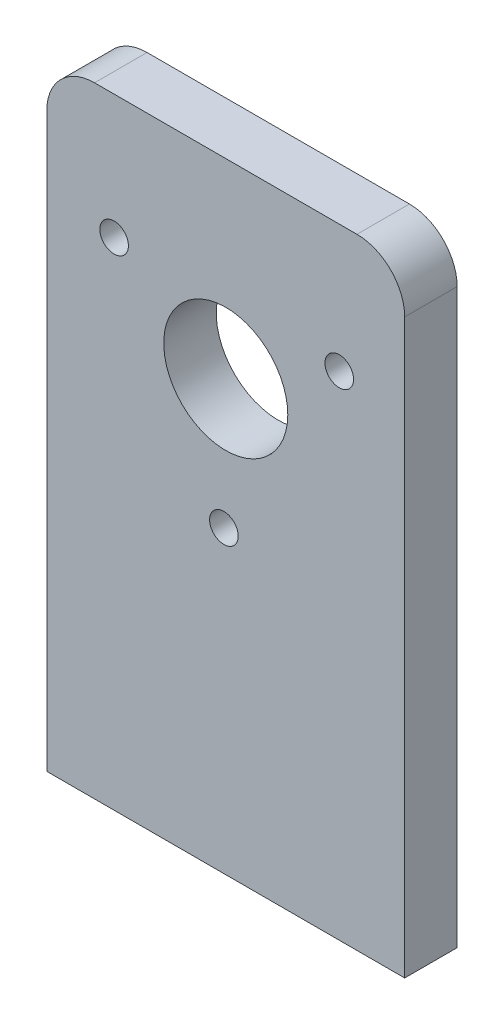
ISO-10303-21;
HEADER;
FILE_DESCRIPTION(('STEP AP214'),'2;1');
FILE_NAME('part.step','',(''),(''),'','','');
FILE_SCHEMA(('AUTOMOTIVE_DESIGN { 1 0 10303 214 1 1 1 1 }'));
ENDSEC;
DATA;
#1=APPLICATION_CONTEXT('core data for automotive mechanical design processes');
#2=APPLICATION_PROTOCOL_DEFINITION('international standard','automotive_design',2000,#1);
#3=PRODUCT_CONTEXT('',#1,'mechanical');
#4=PRODUCT('Part','Part','',(#3));
#5=PRODUCT_RELATED_PRODUCT_CATEGORY('part','',(#4));
#6=PRODUCT_DEFINITION_FORMATION('','',#4);
#7=PRODUCT_DEFINITION_CONTEXT('part definition',#1,'design');
#8=PRODUCT_DEFINITION('design','',#6,#7);
#9=PRODUCT_DEFINITION_SHAPE('','',#8);
#10=(LENGTH_UNIT() NAMED_UNIT(*) SI_UNIT(.MILLI.,.METRE.));
#11=(NAMED_UNIT(*) PLANE_ANGLE_UNIT() SI_UNIT($,.RADIAN.));
#12=(NAMED_UNIT(*) SI_UNIT($,.STERADIAN.) SOLID_ANGLE_UNIT());
#13=UNCERTAINTY_MEASURE_WITH_UNIT(LENGTH_MEASURE(1.E-05),#10,'distance_accuracy_value','');
#14=(GEOMETRIC_REPRESENTATION_CONTEXT(3) GLOBAL_UNCERTAINTY_ASSIGNED_CONTEXT((#13)) GLOBAL_UNIT_ASSIGNED_CONTEXT((#10,
#11,#12)) REPRESENTATION_CONTEXT('',''));
#15=CARTESIAN_POINT('',(0.,0.,0.));
#16=DIRECTION('',(0.,0.,1.));
#17=DIRECTION('',(1.,0.,0.));
#18=AXIS2_PLACEMENT_3D('',#15,#16,#17);
#19=CARTESIAN_POINT('',(10.,120.,11.));
#20=DIRECTION('',(0.,0.,-1.));
#21=DIRECTION('',(-1.,0.,0.));
#22=AXIS2_PLACEMENT_3D('',#19,#20,#21);
#23=PLANE('',#22);
#24=DIRECTION('',(0.,-1.,0.));
#25=VECTOR('',#24,1.);
#26=CARTESIAN_POINT('',(0.,0.,11.));
#27=LINE('',#26,#25);
#28=CARTESIAN_POINT('',(0.,120.,11.));
#29=VERTEX_POINT('',#28);
#30=CARTESIAN_POINT('',(0.,0.,11.));
#31=VERTEX_POINT('',#30);
#32=EDGE_CURVE('E135',#29,#31,#27,.T.);
#33=ORIENTED_EDGE('',*,*,#32,.T.);
#34=DIRECTION('',(1.,0.,0.));
#35=VECTOR('',#34,1.);
#36=CARTESIAN_POINT('',(0.,0.,11.));
#37=LINE('',#36,#35);
#38=CARTESIAN_POINT('',(75.,0.,11.));
#39=VERTEX_POINT('',#38);
#40=EDGE_CURVE('E93',#31,#39,#37,.T.);
#41=ORIENTED_EDGE('',*,*,#40,.T.);
#42=DIRECTION('',(0.,1.,0.));
#43=VECTOR('',#42,1.);
#44=CARTESIAN_POINT('',(75.,0.,11.));
#45=LINE('',#44,#43);
#46=CARTESIAN_POINT('',(75.,120.,11.));
#47=VERTEX_POINT('',#46);
#48=EDGE_CURVE('E106',#39,#47,#45,.T.);
#49=ORIENTED_EDGE('',*,*,#48,.T.);
#50=CARTESIAN_POINT('',(65.,120.,11.));
#51=DIRECTION('',(0.,0.,1.));
#52=DIRECTION('',(1.,0.,0.));
#53=AXIS2_PLACEMENT_3D('',#50,#51,#52);
#54=CIRCLE('',#53,9.99999999999999);
#55=CARTESIAN_POINT('',(64.9999999999999,130.,11.));
#56=VERTEX_POINT('',#55);
#57=EDGE_CURVE('E100',#47,#56,#54,.T.);
#58=ORIENTED_EDGE('',*,*,#57,.T.);
#59=DIRECTION('',(-1.,0.,0.));
#60=VECTOR('',#59,1.);
#61=CARTESIAN_POINT('',(10.0000000000001,130.,11.));
#62=LINE('',#61,#60);
#63=CARTESIAN_POINT('',(10.0000000000001,130.,11.));
#64=VERTEX_POINT('',#63);
#65=EDGE_CURVE('E104',#56,#64,#62,.T.);
#66=ORIENTED_EDGE('',*,*,#65,.T.);
#67=CARTESIAN_POINT('',(10.,120.,11.));
#68=DIRECTION('',(0.,0.,1.));
#69=DIRECTION('',(-1.,0.,0.));
#70=AXIS2_PLACEMENT_3D('',#67,#68,#69);
#71=CIRCLE('',#70,10.);
#72=EDGE_CURVE('E56',#64,#29,#71,.T.);
#73=ORIENTED_EDGE('',*,*,#72,.T.);
#74=EDGE_LOOP('',(#33,#41,#49,#58,#66,#73));
#75=FACE_BOUND('',#74,.T.);
#76=CARTESIAN_POINT('',(37.5,90.,11.));
#77=DIRECTION('',(0.,0.,1.));
#78=DIRECTION('',(1.,0.,0.));
#79=AXIS2_PLACEMENT_3D('',#76,#77,#78);
#80=CIRCLE('',#79,13.);
#81=CARTESIAN_POINT('',(50.5,90.,11.));
#82=VERTEX_POINT('',#81);
#83=EDGE_CURVE('E128',#82,#82,#80,.T.);
#84=ORIENTED_EDGE('',*,*,#83,.F.);
#85=EDGE_LOOP('',(#84));
#86=FACE_BOUND('',#85,.T.);
#87=CARTESIAN_POINT('',(61.2914469463669,103.286442420686,11.));
#88=DIRECTION('',(0.,0.,1.));
#89=DIRECTION('',(1.,0.,0.));
#90=AXIS2_PLACEMENT_3D('',#87,#88,#89);
#91=CIRCLE('',#90,3.);
#92=CARTESIAN_POINT('',(64.2914469463669,103.286442420686,11.));
#93=VERTEX_POINT('',#92);
#94=EDGE_CURVE('E199',#93,#93,#91,.T.);
#95=ORIENTED_EDGE('',*,*,#94,.F.);
#96=EDGE_LOOP('',(#95));
#97=FACE_BOUND('',#96,.T.);
#98=CARTESIAN_POINT('',(14.097879864583,103.960776238,11.));
#99=DIRECTION('',(0.,0.,1.));
#100=DIRECTION('',(1.,0.,0.));
#101=AXIS2_PLACEMENT_3D('',#98,#99,#100);
#102=CIRCLE('',#101,3.);
#103=CARTESIAN_POINT('',(17.097879864583,103.960776238,11.));
#104=VERTEX_POINT('',#103);
#105=EDGE_CURVE('E193',#104,#104,#102,.T.);
#106=ORIENTED_EDGE('',*,*,#105,.F.);
#107=EDGE_LOOP('',(#106));
#108=FACE_BOUND('',#107,.T.);
#109=CARTESIAN_POINT('',(37.11067318905,62.7527813413135,11.));
#110=DIRECTION('',(0.,0.,1.));
#111=DIRECTION('',(1.,0.,0.));
#112=AXIS2_PLACEMENT_3D('',#109,#110,#111);
#113=CIRCLE('',#112,3.);
#114=CARTESIAN_POINT('',(40.11067318905,62.7527813413135,11.));
#115=VERTEX_POINT('',#114);
#116=EDGE_CURVE('E184',#115,#115,#113,.T.);
#117=ORIENTED_EDGE('',*,*,#116,.F.);
#118=EDGE_LOOP('',(#117));
#119=FACE_BOUND('',#118,.T.);
#120=ADVANCED_FACE('F39',(#75,#86,#97,#108,#119),#23,.F.);
#121=CARTESIAN_POINT('',(10.,120.,0.));
#122=DIRECTION('',(0.,0.,-1.));
#123=DIRECTION('',(-1.,0.,0.));
#124=AXIS2_PLACEMENT_3D('',#121,#122,#123);
#125=PLANE('',#124);
#126=CARTESIAN_POINT('',(14.097879864583,103.960776238,0.));
#127=DIRECTION('',(0.,0.,1.));
#128=DIRECTION('',(1.,0.,0.));
#129=AXIS2_PLACEMENT_3D('',#126,#127,#128);
#130=CIRCLE('',#129,3.);
#131=CARTESIAN_POINT('',(17.097879864583,103.960776238,0.));
#132=VERTEX_POINT('',#131);
#133=EDGE_CURVE('E190',#132,#132,#130,.T.);
#134=ORIENTED_EDGE('',*,*,#133,.T.);
#135=EDGE_LOOP('',(#134));
#136=FACE_BOUND('',#135,.T.);
#137=CARTESIAN_POINT('',(37.5,90.,0.));
#138=DIRECTION('',(0.,0.,1.));
#139=DIRECTION('',(1.,0.,0.));
#140=AXIS2_PLACEMENT_3D('',#137,#138,#139);
#141=CIRCLE('',#140,13.);
#142=CARTESIAN_POINT('',(50.5,90.,0.));
#143=VERTEX_POINT('',#142);
#144=EDGE_CURVE('E202',#143,#143,#141,.T.);
#145=ORIENTED_EDGE('',*,*,#144,.T.);
#146=EDGE_LOOP('',(#145));
#147=FACE_BOUND('',#146,.T.);
#148=DIRECTION('',(0.,-1.,0.));
#149=VECTOR('',#148,1.);
#150=CARTESIAN_POINT('',(0.,0.,0.));
#151=LINE('',#150,#149);
#152=CARTESIAN_POINT('',(0.,120.,0.));
#153=VERTEX_POINT('',#152);
#154=CARTESIAN_POINT('',(0.,0.,0.));
#155=VERTEX_POINT('',#154);
#156=EDGE_CURVE('E124',#153,#155,#151,.T.);
#157=ORIENTED_EDGE('',*,*,#156,.F.);
#158=CARTESIAN_POINT('',(10.,120.,0.));
#159=DIRECTION('',(0.,0.,1.));
#160=DIRECTION('',(-1.,0.,0.));
#161=AXIS2_PLACEMENT_3D('',#158,#159,#160);
#162=CIRCLE('',#161,10.);
#163=CARTESIAN_POINT('',(10.0000000000001,130.,0.));
#164=VERTEX_POINT('',#163);
#165=EDGE_CURVE('E85',#164,#153,#162,.T.);
#166=ORIENTED_EDGE('',*,*,#165,.F.);
#167=DIRECTION('',(-1.,0.,0.));
#168=VECTOR('',#167,1.);
#169=CARTESIAN_POINT('',(10.0000000000001,130.,0.));
#170=LINE('',#169,#168);
#171=CARTESIAN_POINT('',(64.9999999999999,130.,0.));
#172=VERTEX_POINT('',#171);
#173=EDGE_CURVE('E79',#172,#164,#170,.T.);
#174=ORIENTED_EDGE('',*,*,#173,.F.);
#175=CARTESIAN_POINT('',(65.,120.,0.));
#176=DIRECTION('',(0.,0.,1.));
#177=DIRECTION('',(1.,0.,0.));
#178=AXIS2_PLACEMENT_3D('',#175,#176,#177);
#179=CIRCLE('',#178,9.99999999999999);
#180=CARTESIAN_POINT('',(75.,120.,0.));
#181=VERTEX_POINT('',#180);
#182=EDGE_CURVE('E114',#181,#172,#179,.T.);
#183=ORIENTED_EDGE('',*,*,#182,.F.);
#184=DIRECTION('',(0.,1.,0.));
#185=VECTOR('',#184,1.);
#186=CARTESIAN_POINT('',(75.,0.,0.));
#187=LINE('',#186,#185);
#188=CARTESIAN_POINT('',(75.,0.,0.));
#189=VERTEX_POINT('',#188);
#190=EDGE_CURVE('E130',#189,#181,#187,.T.);
#191=ORIENTED_EDGE('',*,*,#190,.F.);
#192=DIRECTION('',(1.,0.,0.));
#193=VECTOR('',#192,1.);
#194=CARTESIAN_POINT('',(0.,0.,0.));
#195=LINE('',#194,#193);
#196=EDGE_CURVE('E127',#155,#189,#195,.T.);
#197=ORIENTED_EDGE('',*,*,#196,.F.);
#198=EDGE_LOOP('',(#157,#166,#174,#183,#191,#197));
#199=FACE_BOUND('',#198,.T.);
#200=CARTESIAN_POINT('',(61.2914469463669,103.286442420686,0.));
#201=DIRECTION('',(0.,0.,1.));
#202=DIRECTION('',(1.,0.,0.));
#203=AXIS2_PLACEMENT_3D('',#200,#201,#202);
#204=CIRCLE('',#203,3.);
#205=CARTESIAN_POINT('',(64.2914469463669,103.286442420686,0.));
#206=VERTEX_POINT('',#205);
#207=EDGE_CURVE('E196',#206,#206,#204,.T.);
#208=ORIENTED_EDGE('',*,*,#207,.T.);
#209=EDGE_LOOP('',(#208));
#210=FACE_BOUND('',#209,.T.);
#211=CARTESIAN_POINT('',(37.11067318905,62.7527813413135,0.));
#212=DIRECTION('',(0.,0.,1.));
#213=DIRECTION('',(1.,0.,0.));
#214=AXIS2_PLACEMENT_3D('',#211,#212,#213);
#215=CIRCLE('',#214,3.);
#216=CARTESIAN_POINT('',(40.11067318905,62.7527813413135,0.));
#217=VERTEX_POINT('',#216);
#218=EDGE_CURVE('E187',#217,#217,#215,.T.);
#219=ORIENTED_EDGE('',*,*,#218,.T.);
#220=EDGE_LOOP('',(#219));
#221=FACE_BOUND('',#220,.T.);
#222=ADVANCED_FACE('F144',(#136,#147,#199,#210,#221),#125,.T.);
#223=CARTESIAN_POINT('',(0.,0.,11.));
#224=DIRECTION('',(1.,0.,0.));
#225=DIRECTION('',(0.,0.,-1.));
#226=AXIS2_PLACEMENT_3D('',#223,#224,#225);
#227=PLANE('',#226);
#228=ORIENTED_EDGE('',*,*,#156,.T.);
#229=DIRECTION('',(0.,0.,-1.));
#230=VECTOR('',#229,1.);
#231=CARTESIAN_POINT('',(0.,0.,11.));
#232=LINE('',#231,#230);
#233=EDGE_CURVE('E11',#31,#155,#232,.T.);
#234=ORIENTED_EDGE('',*,*,#233,.F.);
#235=ORIENTED_EDGE('',*,*,#32,.F.);
#236=DIRECTION('',(0.,0.,-1.));
#237=VECTOR('',#236,1.);
#238=CARTESIAN_POINT('',(0.,120.,11.));
#239=LINE('',#238,#237);
#240=EDGE_CURVE('E120',#29,#153,#239,.T.);
#241=ORIENTED_EDGE('',*,*,#240,.T.);
#242=EDGE_LOOP('',(#228,#234,#235,#241));
#243=FACE_BOUND('',#242,.T.);
#244=ADVANCED_FACE('F41',(#243),#227,.F.);
#245=CARTESIAN_POINT('',(0.,0.,11.));
#246=DIRECTION('',(0.,1.,0.));
#247=DIRECTION('',(0.,0.,1.));
#248=AXIS2_PLACEMENT_3D('',#245,#246,#247);
#249=PLANE('',#248);
#250=ORIENTED_EDGE('',*,*,#196,.T.);
#251=DIRECTION('',(0.,0.,-1.));
#252=VECTOR('',#251,1.);
#253=CARTESIAN_POINT('',(75.,0.,11.));
#254=LINE('',#253,#252);
#255=EDGE_CURVE('E48',#39,#189,#254,.T.);
#256=ORIENTED_EDGE('',*,*,#255,.F.);
#257=ORIENTED_EDGE('',*,*,#40,.F.);
#258=ORIENTED_EDGE('',*,*,#233,.T.);
#259=EDGE_LOOP('',(#250,#256,#257,#258));
#260=FACE_BOUND('',#259,.T.);
#261=ADVANCED_FACE('F266',(#260),#249,.F.);
#262=CARTESIAN_POINT('',(75.,0.,11.));
#263=DIRECTION('',(-1.,0.,0.));
#264=DIRECTION('',(0.,-1.,0.));
#265=AXIS2_PLACEMENT_3D('',#262,#263,#264);
#266=PLANE('',#265);
#267=ORIENTED_EDGE('',*,*,#190,.T.);
#268=DIRECTION('',(0.,0.,-1.));
#269=VECTOR('',#268,1.);
#270=CARTESIAN_POINT('',(75.,120.,11.));
#271=LINE('',#270,#269);
#272=EDGE_CURVE('E115',#47,#181,#271,.T.);
#273=ORIENTED_EDGE('',*,*,#272,.F.);
#274=ORIENTED_EDGE('',*,*,#48,.F.);
#275=ORIENTED_EDGE('',*,*,#255,.T.);
#276=EDGE_LOOP('',(#267,#273,#274,#275));
#277=FACE_BOUND('',#276,.T.);
#278=ADVANCED_FACE('F141',(#277),#266,.F.);
#279=CARTESIAN_POINT('',(65.,120.,11.));
#280=DIRECTION('',(0.,0.,-1.));
#281=DIRECTION('',(-1.,0.,0.));
#282=AXIS2_PLACEMENT_3D('',#279,#280,#281);
#283=CYLINDRICAL_SURFACE('',#282,9.99999999999999);
#284=ORIENTED_EDGE('',*,*,#182,.T.);
#285=DIRECTION('',(0.,0.,-1.));
#286=VECTOR('',#285,1.);
#287=CARTESIAN_POINT('',(64.9999999999999,130.,11.));
#288=LINE('',#287,#286);
#289=EDGE_CURVE('E111',#56,#172,#288,.T.);
#290=ORIENTED_EDGE('',*,*,#289,.F.);
#291=ORIENTED_EDGE('',*,*,#57,.F.);
#292=ORIENTED_EDGE('',*,*,#272,.T.);
#293=EDGE_LOOP('',(#284,#290,#291,#292));
#294=FACE_BOUND('',#293,.T.);
#295=ADVANCED_FACE('F112',(#294),#283,.T.);
#296=CARTESIAN_POINT('',(10.0000000000001,130.,11.));
#297=DIRECTION('',(0.,-1.,0.));
#298=DIRECTION('',(0.,0.,-1.));
#299=AXIS2_PLACEMENT_3D('',#296,#297,#298);
#300=PLANE('',#299);
#301=ORIENTED_EDGE('',*,*,#173,.T.);
#302=DIRECTION('',(0.,0.,-1.));
#303=VECTOR('',#302,1.);
#304=CARTESIAN_POINT('',(10.0000000000001,130.,11.));
#305=LINE('',#304,#303);
#306=EDGE_CURVE('E116',#64,#164,#305,.T.);
#307=ORIENTED_EDGE('',*,*,#306,.F.);
#308=ORIENTED_EDGE('',*,*,#65,.F.);
#309=ORIENTED_EDGE('',*,*,#289,.T.);
#310=EDGE_LOOP('',(#301,#307,#308,#309));
#311=FACE_BOUND('',#310,.T.);
#312=ADVANCED_FACE('F118',(#311),#300,.F.);
#313=CARTESIAN_POINT('',(10.,120.,11.));
#314=DIRECTION('',(0.,0.,-1.));
#315=DIRECTION('',(-1.,0.,0.));
#316=AXIS2_PLACEMENT_3D('',#313,#314,#315);
#317=CYLINDRICAL_SURFACE('',#316,10.);
#318=ORIENTED_EDGE('',*,*,#165,.T.);
#319=ORIENTED_EDGE('',*,*,#240,.F.);
#320=ORIENTED_EDGE('',*,*,#72,.F.);
#321=ORIENTED_EDGE('',*,*,#306,.T.);
#322=EDGE_LOOP('',(#318,#319,#320,#321));
#323=FACE_BOUND('',#322,.T.);
#324=ADVANCED_FACE('F149',(#323),#317,.T.);
#325=CARTESIAN_POINT('',(37.5,90.,11.));
#326=DIRECTION('',(0.,0.,-1.));
#327=DIRECTION('',(-1.,0.,0.));
#328=AXIS2_PLACEMENT_3D('',#325,#326,#327);
#329=CYLINDRICAL_SURFACE('',#328,13.);
#330=ORIENTED_EDGE('',*,*,#83,.T.);
#331=EDGE_LOOP('',(#330));
#332=FACE_BOUND('',#331,.T.);
#333=ORIENTED_EDGE('',*,*,#144,.F.);
#334=EDGE_LOOP('',(#333));
#335=FACE_BOUND('',#334,.T.);
#336=ADVANCED_FACE('F151',(#332,#335),#329,.F.);
#337=CARTESIAN_POINT('',(61.2914469463669,103.286442420686,11.));
#338=DIRECTION('',(0.,0.,-1.));
#339=DIRECTION('',(-1.,0.,0.));
#340=AXIS2_PLACEMENT_3D('',#337,#338,#339);
#341=CYLINDRICAL_SURFACE('',#340,3.);
#342=ORIENTED_EDGE('',*,*,#94,.T.);
#343=EDGE_LOOP('',(#342));
#344=FACE_BOUND('',#343,.T.);
#345=ORIENTED_EDGE('',*,*,#207,.F.);
#346=EDGE_LOOP('',(#345));
#347=FACE_BOUND('',#346,.T.);
#348=ADVANCED_FACE('F157',(#344,#347),#341,.F.);
#349=CARTESIAN_POINT('',(14.097879864583,103.960776238,11.));
#350=DIRECTION('',(0.,0.,-1.));
#351=DIRECTION('',(-1.,0.,0.));
#352=AXIS2_PLACEMENT_3D('',#349,#350,#351);
#353=CYLINDRICAL_SURFACE('',#352,3.);
#354=ORIENTED_EDGE('',*,*,#105,.T.);
#355=EDGE_LOOP('',(#354));
#356=FACE_BOUND('',#355,.T.);
#357=ORIENTED_EDGE('',*,*,#133,.F.);
#358=EDGE_LOOP('',(#357));
#359=FACE_BOUND('',#358,.T.);
#360=ADVANCED_FACE('F171',(#356,#359),#353,.F.);
#361=CARTESIAN_POINT('',(37.11067318905,62.7527813413135,11.));
#362=DIRECTION('',(0.,0.,-1.));
#363=DIRECTION('',(-1.,0.,0.));
#364=AXIS2_PLACEMENT_3D('',#361,#362,#363);
#365=CYLINDRICAL_SURFACE('',#364,3.);
#366=ORIENTED_EDGE('',*,*,#116,.T.);
#367=EDGE_LOOP('',(#366));
#368=FACE_BOUND('',#367,.T.);
#369=ORIENTED_EDGE('',*,*,#218,.F.);
#370=EDGE_LOOP('',(#369));
#371=FACE_BOUND('',#370,.T.);
#372=ADVANCED_FACE('F175',(#368,#371),#365,.F.);
#373=CLOSED_SHELL('',(#120,#222,#244,#261,#278,#295,#312,#324,#336,#348,#360,#372));
#374=MANIFOLD_SOLID_BREP('B2',#373);
#375=ADVANCED_BREP_SHAPE_REPRESENTATION('',(#18,#374),#14);
#376=SHAPE_DEFINITION_REPRESENTATION(#9,#375);
ENDSEC;
END-ISO-10303-21;
